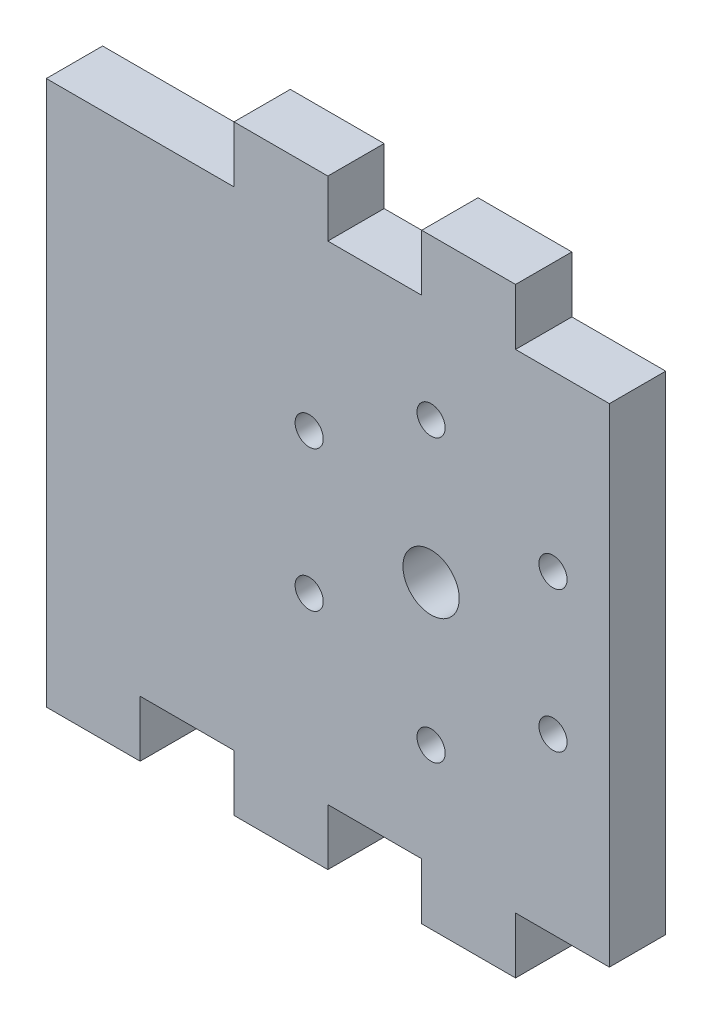
ISO-10303-21;
HEADER;
FILE_DESCRIPTION(('STEP AP214'),'2;1');
FILE_NAME('part.step','',(''),(''),'','','');
FILE_SCHEMA(('AUTOMOTIVE_DESIGN { 1 0 10303 214 1 1 1 1 }'));
ENDSEC;
DATA;
#1=APPLICATION_CONTEXT('core data for automotive mechanical design processes');
#2=APPLICATION_PROTOCOL_DEFINITION('international standard','automotive_design',2000,#1);
#3=PRODUCT_CONTEXT('',#1,'mechanical');
#4=PRODUCT('Part','Part','',(#3));
#5=PRODUCT_RELATED_PRODUCT_CATEGORY('part','',(#4));
#6=PRODUCT_DEFINITION_FORMATION('','',#4);
#7=PRODUCT_DEFINITION_CONTEXT('part definition',#1,'design');
#8=PRODUCT_DEFINITION('design','',#6,#7);
#9=PRODUCT_DEFINITION_SHAPE('','',#8);
#10=(LENGTH_UNIT() NAMED_UNIT(*) SI_UNIT(.MILLI.,.METRE.));
#11=(NAMED_UNIT(*) PLANE_ANGLE_UNIT() SI_UNIT($,.RADIAN.));
#12=(NAMED_UNIT(*) SI_UNIT($,.STERADIAN.) SOLID_ANGLE_UNIT());
#13=UNCERTAINTY_MEASURE_WITH_UNIT(LENGTH_MEASURE(1.E-05),#10,'distance_accuracy_value','');
#14=(GEOMETRIC_REPRESENTATION_CONTEXT(3) GLOBAL_UNCERTAINTY_ASSIGNED_CONTEXT((#13)) GLOBAL_UNIT_ASSIGNED_CONTEXT((#10,
#11,#12)) REPRESENTATION_CONTEXT('',''));
#15=CARTESIAN_POINT('',(0.,0.,0.));
#16=DIRECTION('',(0.,0.,1.));
#17=DIRECTION('',(1.,0.,0.));
#18=AXIS2_PLACEMENT_3D('',#15,#16,#17);
#19=CARTESIAN_POINT('',(0.,0.,3.));
#20=DIRECTION('',(0.,0.,-1.));
#21=DIRECTION('',(-1.,0.,0.));
#22=AXIS2_PLACEMENT_3D('',#19,#20,#21);
#23=PLANE('',#22);
#24=DIRECTION('',(1.,0.,0.));
#25=VECTOR('',#24,1.);
#26=CARTESIAN_POINT('',(25.,-26.,3.));
#27=LINE('',#26,#25);
#28=CARTESIAN_POINT('',(25.,-26.,3.));
#29=VERTEX_POINT('',#28);
#30=CARTESIAN_POINT('',(30.,-26.,3.));
#31=VERTEX_POINT('',#30);
#32=EDGE_CURVE('E256',#29,#31,#27,.T.);
#33=ORIENTED_EDGE('',*,*,#32,.T.);
#34=DIRECTION('',(0.,1.,0.));
#35=VECTOR('',#34,1.);
#36=CARTESIAN_POINT('',(30.,0.,3.));
#37=LINE('',#36,#35);
#38=CARTESIAN_POINT('',(30.,0.,3.));
#39=VERTEX_POINT('',#38);
#40=EDGE_CURVE('E134',#31,#39,#37,.T.);
#41=ORIENTED_EDGE('',*,*,#40,.T.);
#42=DIRECTION('',(-1.,0.,0.));
#43=VECTOR('',#42,1.);
#44=CARTESIAN_POINT('',(25.,0.,3.));
#45=LINE('',#44,#43);
#46=CARTESIAN_POINT('',(25.,0.,3.));
#47=VERTEX_POINT('',#46);
#48=EDGE_CURVE('E313',#39,#47,#45,.T.);
#49=ORIENTED_EDGE('',*,*,#48,.T.);
#50=DIRECTION('',(0.,1.,0.));
#51=VECTOR('',#50,1.);
#52=CARTESIAN_POINT('',(25.,2.99999999999994,3.));
#53=LINE('',#52,#51);
#54=CARTESIAN_POINT('',(25.,2.99999999999994,3.));
#55=VERTEX_POINT('',#54);
#56=EDGE_CURVE('E332',#47,#55,#53,.T.);
#57=ORIENTED_EDGE('',*,*,#56,.T.);
#58=DIRECTION('',(-1.,0.,0.));
#59=VECTOR('',#58,1.);
#60=CARTESIAN_POINT('',(20.,2.99999999999995,3.));
#61=LINE('',#60,#59);
#62=CARTESIAN_POINT('',(20.,2.99999999999995,3.));
#63=VERTEX_POINT('',#62);
#64=EDGE_CURVE('E329',#55,#63,#61,.T.);
#65=ORIENTED_EDGE('',*,*,#64,.T.);
#66=DIRECTION('',(0.,-1.,0.));
#67=VECTOR('',#66,1.);
#68=CARTESIAN_POINT('',(20.,0.,3.));
#69=LINE('',#68,#67);
#70=CARTESIAN_POINT('',(20.,0.,3.));
#71=VERTEX_POINT('',#70);
#72=EDGE_CURVE('E331',#63,#71,#69,.T.);
#73=ORIENTED_EDGE('',*,*,#72,.T.);
#74=DIRECTION('',(-1.,0.,0.));
#75=VECTOR('',#74,1.);
#76=CARTESIAN_POINT('',(14.9999999999999,0.,3.));
#77=LINE('',#76,#75);
#78=CARTESIAN_POINT('',(14.9999999999999,0.,3.));
#79=VERTEX_POINT('',#78);
#80=EDGE_CURVE('E334',#71,#79,#77,.T.);
#81=ORIENTED_EDGE('',*,*,#80,.T.);
#82=DIRECTION('',(0.,1.,0.));
#83=VECTOR('',#82,1.);
#84=CARTESIAN_POINT('',(14.9999999999999,2.99999999999994,3.));
#85=LINE('',#84,#83);
#86=CARTESIAN_POINT('',(14.9999999999999,2.99999999999994,3.));
#87=VERTEX_POINT('',#86);
#88=EDGE_CURVE('E340',#79,#87,#85,.T.);
#89=ORIENTED_EDGE('',*,*,#88,.T.);
#90=DIRECTION('',(-1.,0.,0.));
#91=VECTOR('',#90,1.);
#92=CARTESIAN_POINT('',(9.99999999999993,2.99999999999996,3.));
#93=LINE('',#92,#91);
#94=CARTESIAN_POINT('',(9.99999999999993,2.99999999999996,3.));
#95=VERTEX_POINT('',#94);
#96=EDGE_CURVE('E342',#87,#95,#93,.T.);
#97=ORIENTED_EDGE('',*,*,#96,.T.);
#98=DIRECTION('',(0.,-1.,0.));
#99=VECTOR('',#98,1.);
#100=CARTESIAN_POINT('',(9.99999999999994,0.,3.));
#101=LINE('',#100,#99);
#102=CARTESIAN_POINT('',(9.99999999999994,0.,3.));
#103=VERTEX_POINT('',#102);
#104=EDGE_CURVE('E344',#95,#103,#101,.T.);
#105=ORIENTED_EDGE('',*,*,#104,.T.);
#106=DIRECTION('',(-1.,0.,0.));
#107=VECTOR('',#106,1.);
#108=CARTESIAN_POINT('',(0.,0.,3.));
#109=LINE('',#108,#107);
#110=CARTESIAN_POINT('',(0.,0.,3.));
#111=VERTEX_POINT('',#110);
#112=EDGE_CURVE('E346',#103,#111,#109,.T.);
#113=ORIENTED_EDGE('',*,*,#112,.T.);
#114=DIRECTION('',(0.,-1.,0.));
#115=VECTOR('',#114,1.);
#116=CARTESIAN_POINT('',(0.,0.,3.));
#117=LINE('',#116,#115);
#118=CARTESIAN_POINT('',(0.,-29.,3.));
#119=VERTEX_POINT('',#118);
#120=EDGE_CURVE('E348',#111,#119,#117,.T.);
#121=ORIENTED_EDGE('',*,*,#120,.T.);
#122=DIRECTION('',(1.,0.,0.));
#123=VECTOR('',#122,1.);
#124=CARTESIAN_POINT('',(0.,-29.,3.));
#125=LINE('',#124,#123);
#126=CARTESIAN_POINT('',(4.99999999999994,-29.,3.));
#127=VERTEX_POINT('',#126);
#128=EDGE_CURVE('E350',#119,#127,#125,.T.);
#129=ORIENTED_EDGE('',*,*,#128,.T.);
#130=DIRECTION('',(0.,1.,0.));
#131=VECTOR('',#130,1.);
#132=CARTESIAN_POINT('',(4.99999999999994,-29.,3.));
#133=LINE('',#132,#131);
#134=CARTESIAN_POINT('',(4.99999999999994,-26.,3.));
#135=VERTEX_POINT('',#134);
#136=EDGE_CURVE('E352',#127,#135,#133,.T.);
#137=ORIENTED_EDGE('',*,*,#136,.T.);
#138=DIRECTION('',(1.,0.,0.));
#139=VECTOR('',#138,1.);
#140=CARTESIAN_POINT('',(4.99999999999994,-26.,3.));
#141=LINE('',#140,#139);
#142=CARTESIAN_POINT('',(9.99999999999994,-26.,3.));
#143=VERTEX_POINT('',#142);
#144=EDGE_CURVE('E354',#135,#143,#141,.T.);
#145=ORIENTED_EDGE('',*,*,#144,.T.);
#146=DIRECTION('',(0.,-1.,0.));
#147=VECTOR('',#146,1.);
#148=CARTESIAN_POINT('',(9.99999999999994,-26.,3.));
#149=LINE('',#148,#147);
#150=CARTESIAN_POINT('',(9.99999999999995,-29.,3.));
#151=VERTEX_POINT('',#150);
#152=EDGE_CURVE('E356',#143,#151,#149,.T.);
#153=ORIENTED_EDGE('',*,*,#152,.T.);
#154=DIRECTION('',(1.,0.,0.));
#155=VECTOR('',#154,1.);
#156=CARTESIAN_POINT('',(9.99999999999995,-29.,3.));
#157=LINE('',#156,#155);
#158=CARTESIAN_POINT('',(14.9999999999999,-29.,3.));
#159=VERTEX_POINT('',#158);
#160=EDGE_CURVE('E358',#151,#159,#157,.T.);
#161=ORIENTED_EDGE('',*,*,#160,.T.);
#162=DIRECTION('',(0.,1.,0.));
#163=VECTOR('',#162,1.);
#164=CARTESIAN_POINT('',(14.9999999999999,-29.,3.));
#165=LINE('',#164,#163);
#166=CARTESIAN_POINT('',(15.,-26.,3.));
#167=VERTEX_POINT('',#166);
#168=EDGE_CURVE('E360',#159,#167,#165,.T.);
#169=ORIENTED_EDGE('',*,*,#168,.T.);
#170=DIRECTION('',(1.,0.,0.));
#171=VECTOR('',#170,1.);
#172=CARTESIAN_POINT('',(15.,-26.,3.));
#173=LINE('',#172,#171);
#174=CARTESIAN_POINT('',(20.,-26.,3.));
#175=VERTEX_POINT('',#174);
#176=EDGE_CURVE('E195',#167,#175,#173,.T.);
#177=ORIENTED_EDGE('',*,*,#176,.T.);
#178=DIRECTION('',(0.,-1.,0.));
#179=VECTOR('',#178,1.);
#180=CARTESIAN_POINT('',(20.,-29.,3.));
#181=LINE('',#180,#179);
#182=CARTESIAN_POINT('',(20.,-29.,3.));
#183=VERTEX_POINT('',#182);
#184=EDGE_CURVE('E189',#175,#183,#181,.T.);
#185=ORIENTED_EDGE('',*,*,#184,.T.);
#186=DIRECTION('',(1.,0.,0.));
#187=VECTOR('',#186,1.);
#188=CARTESIAN_POINT('',(20.,-29.,3.));
#189=LINE('',#188,#187);
#190=CARTESIAN_POINT('',(25.,-29.,3.));
#191=VERTEX_POINT('',#190);
#192=EDGE_CURVE('E193',#183,#191,#189,.T.);
#193=ORIENTED_EDGE('',*,*,#192,.T.);
#194=DIRECTION('',(0.,1.,0.));
#195=VECTOR('',#194,1.);
#196=CARTESIAN_POINT('',(25.,-29.,3.));
#197=LINE('',#196,#195);
#198=EDGE_CURVE('E49',#191,#29,#197,.T.);
#199=ORIENTED_EDGE('',*,*,#198,.T.);
#200=EDGE_LOOP('',(#33,#41,#49,#57,#65,#73,#81,#89,#97,#105,#113,#121,#129,#137,#145,#153,#161,
#169,#177,#185,#193,#199));
#201=FACE_BOUND('',#200,.T.);
#202=CARTESIAN_POINT('',(20.5,-5.50000000000007,3.));
#203=DIRECTION('',(0.,0.,1.));
#204=DIRECTION('',(1.,0.,0.));
#205=AXIS2_PLACEMENT_3D('',#202,#203,#204);
#206=CIRCLE('',#205,0.750000000000002);
#207=CARTESIAN_POINT('',(21.25,-5.50000000000007,3.));
#208=VERTEX_POINT('',#207);
#209=EDGE_CURVE('E217',#208,#208,#206,.T.);
#210=ORIENTED_EDGE('',*,*,#209,.F.);
#211=EDGE_LOOP('',(#210));
#212=FACE_BOUND('',#211,.T.);
#213=CARTESIAN_POINT('',(20.5,-13.0000000000001,3.));
#214=DIRECTION('',(0.,0.,1.));
#215=DIRECTION('',(1.,0.,0.));
#216=AXIS2_PLACEMENT_3D('',#213,#214,#215);
#217=CIRCLE('',#216,1.5);
#218=CARTESIAN_POINT('',(22.,-13.0000000000001,3.));
#219=VERTEX_POINT('',#218);
#220=EDGE_CURVE('E454',#219,#219,#217,.T.);
#221=ORIENTED_EDGE('',*,*,#220,.F.);
#222=EDGE_LOOP('',(#221));
#223=FACE_BOUND('',#222,.T.);
#224=CARTESIAN_POINT('',(26.9951905283833,-9.25000000000007,3.));
#225=DIRECTION('',(0.,0.,1.));
#226=DIRECTION('',(1.,0.,0.));
#227=AXIS2_PLACEMENT_3D('',#224,#225,#226);
#228=CIRCLE('',#227,0.750000000000002);
#229=CARTESIAN_POINT('',(27.7451905283833,-9.25000000000007,3.));
#230=VERTEX_POINT('',#229);
#231=EDGE_CURVE('E448',#230,#230,#228,.T.);
#232=ORIENTED_EDGE('',*,*,#231,.F.);
#233=EDGE_LOOP('',(#232));
#234=FACE_BOUND('',#233,.T.);
#235=CARTESIAN_POINT('',(26.9951905283833,-16.7500000000001,3.));
#236=DIRECTION('',(0.,0.,1.));
#237=DIRECTION('',(1.,0.,0.));
#238=AXIS2_PLACEMENT_3D('',#235,#236,#237);
#239=CIRCLE('',#238,0.750000000000005);
#240=CARTESIAN_POINT('',(27.7451905283833,-16.7500000000001,3.));
#241=VERTEX_POINT('',#240);
#242=EDGE_CURVE('E442',#241,#241,#239,.T.);
#243=ORIENTED_EDGE('',*,*,#242,.F.);
#244=EDGE_LOOP('',(#243));
#245=FACE_BOUND('',#244,.T.);
#246=CARTESIAN_POINT('',(20.5,-20.5000000000001,3.));
#247=DIRECTION('',(0.,0.,1.));
#248=DIRECTION('',(1.,0.,0.));
#249=AXIS2_PLACEMENT_3D('',#246,#247,#248);
#250=CIRCLE('',#249,0.750000000000002);
#251=CARTESIAN_POINT('',(21.25,-20.5000000000001,3.));
#252=VERTEX_POINT('',#251);
#253=EDGE_CURVE('E436',#252,#252,#250,.T.);
#254=ORIENTED_EDGE('',*,*,#253,.F.);
#255=EDGE_LOOP('',(#254));
#256=FACE_BOUND('',#255,.T.);
#257=CARTESIAN_POINT('',(14.0048094716167,-16.7500000000001,3.));
#258=DIRECTION('',(0.,0.,1.));
#259=DIRECTION('',(1.,0.,0.));
#260=AXIS2_PLACEMENT_3D('',#257,#258,#259);
#261=CIRCLE('',#260,0.750000000000002);
#262=CARTESIAN_POINT('',(14.7548094716167,-16.7500000000001,3.));
#263=VERTEX_POINT('',#262);
#264=EDGE_CURVE('E430',#263,#263,#261,.T.);
#265=ORIENTED_EDGE('',*,*,#264,.F.);
#266=EDGE_LOOP('',(#265));
#267=FACE_BOUND('',#266,.T.);
#268=CARTESIAN_POINT('',(14.0048094716167,-9.25000000000008,3.));
#269=DIRECTION('',(0.,0.,1.));
#270=DIRECTION('',(1.,0.,0.));
#271=AXIS2_PLACEMENT_3D('',#268,#269,#270);
#272=CIRCLE('',#271,0.750000000000002);
#273=CARTESIAN_POINT('',(14.7548094716167,-9.25000000000008,3.));
#274=VERTEX_POINT('',#273);
#275=EDGE_CURVE('E421',#274,#274,#272,.T.);
#276=ORIENTED_EDGE('',*,*,#275,.F.);
#277=EDGE_LOOP('',(#276));
#278=FACE_BOUND('',#277,.T.);
#279=ADVANCED_FACE('F32',(#201,#212,#223,#234,#245,#256,#267,#278),#23,.F.);
#280=CARTESIAN_POINT('',(0.,0.,0.));
#281=DIRECTION('',(0.,0.,-1.));
#282=DIRECTION('',(-1.,0.,0.));
#283=AXIS2_PLACEMENT_3D('',#280,#281,#282);
#284=PLANE('',#283);
#285=CARTESIAN_POINT('',(14.0048094716167,-16.7500000000001,0.));
#286=DIRECTION('',(0.,0.,1.));
#287=DIRECTION('',(1.,0.,0.));
#288=AXIS2_PLACEMENT_3D('',#285,#286,#287);
#289=CIRCLE('',#288,0.750000000000002);
#290=CARTESIAN_POINT('',(14.7548094716167,-16.7500000000001,0.));
#291=VERTEX_POINT('',#290);
#292=EDGE_CURVE('E427',#291,#291,#289,.T.);
#293=ORIENTED_EDGE('',*,*,#292,.T.);
#294=EDGE_LOOP('',(#293));
#295=FACE_BOUND('',#294,.T.);
#296=CARTESIAN_POINT('',(26.9951905283833,-16.7500000000001,0.));
#297=DIRECTION('',(0.,0.,1.));
#298=DIRECTION('',(1.,0.,0.));
#299=AXIS2_PLACEMENT_3D('',#296,#297,#298);
#300=CIRCLE('',#299,0.750000000000005);
#301=CARTESIAN_POINT('',(27.7451905283833,-16.7500000000001,0.));
#302=VERTEX_POINT('',#301);
#303=EDGE_CURVE('E439',#302,#302,#300,.T.);
#304=ORIENTED_EDGE('',*,*,#303,.T.);
#305=EDGE_LOOP('',(#304));
#306=FACE_BOUND('',#305,.T.);
#307=CARTESIAN_POINT('',(20.5,-13.0000000000001,0.));
#308=DIRECTION('',(0.,0.,1.));
#309=DIRECTION('',(1.,0.,0.));
#310=AXIS2_PLACEMENT_3D('',#307,#308,#309);
#311=CIRCLE('',#310,1.5);
#312=CARTESIAN_POINT('',(22.,-13.0000000000001,0.));
#313=VERTEX_POINT('',#312);
#314=EDGE_CURVE('E451',#313,#313,#311,.T.);
#315=ORIENTED_EDGE('',*,*,#314,.T.);
#316=EDGE_LOOP('',(#315));
#317=FACE_BOUND('',#316,.T.);
#318=DIRECTION('',(1.,0.,0.));
#319=VECTOR('',#318,1.);
#320=CARTESIAN_POINT('',(25.,-26.,0.));
#321=LINE('',#320,#319);
#322=CARTESIAN_POINT('',(25.,-26.,0.));
#323=VERTEX_POINT('',#322);
#324=CARTESIAN_POINT('',(30.,-26.,0.));
#325=VERTEX_POINT('',#324);
#326=EDGE_CURVE('E213',#323,#325,#321,.T.);
#327=ORIENTED_EDGE('',*,*,#326,.F.);
#328=DIRECTION('',(0.,1.,0.));
#329=VECTOR('',#328,1.);
#330=CARTESIAN_POINT('',(25.,-29.,0.));
#331=LINE('',#330,#329);
#332=CARTESIAN_POINT('',(25.,-29.,0.));
#333=VERTEX_POINT('',#332);
#334=EDGE_CURVE('E126',#333,#323,#331,.T.);
#335=ORIENTED_EDGE('',*,*,#334,.F.);
#336=DIRECTION('',(1.,0.,0.));
#337=VECTOR('',#336,1.);
#338=CARTESIAN_POINT('',(20.,-29.,0.));
#339=LINE('',#338,#337);
#340=CARTESIAN_POINT('',(20.,-29.,0.));
#341=VERTEX_POINT('',#340);
#342=EDGE_CURVE('E120',#341,#333,#339,.T.);
#343=ORIENTED_EDGE('',*,*,#342,.F.);
#344=DIRECTION('',(0.,-1.,0.));
#345=VECTOR('',#344,1.);
#346=CARTESIAN_POINT('',(20.,-29.,0.));
#347=LINE('',#346,#345);
#348=CARTESIAN_POINT('',(20.,-26.,0.));
#349=VERTEX_POINT('',#348);
#350=EDGE_CURVE('E203',#349,#341,#347,.T.);
#351=ORIENTED_EDGE('',*,*,#350,.F.);
#352=DIRECTION('',(1.,0.,0.));
#353=VECTOR('',#352,1.);
#354=CARTESIAN_POINT('',(15.,-26.,0.));
#355=LINE('',#354,#353);
#356=CARTESIAN_POINT('',(15.,-26.,0.));
#357=VERTEX_POINT('',#356);
#358=EDGE_CURVE('E251',#357,#349,#355,.T.);
#359=ORIENTED_EDGE('',*,*,#358,.F.);
#360=DIRECTION('',(0.,1.,0.));
#361=VECTOR('',#360,1.);
#362=CARTESIAN_POINT('',(14.9999999999999,-29.,0.));
#363=LINE('',#362,#361);
#364=CARTESIAN_POINT('',(14.9999999999999,-29.,0.));
#365=VERTEX_POINT('',#364);
#366=EDGE_CURVE('E249',#365,#357,#363,.T.);
#367=ORIENTED_EDGE('',*,*,#366,.F.);
#368=DIRECTION('',(1.,0.,0.));
#369=VECTOR('',#368,1.);
#370=CARTESIAN_POINT('',(9.99999999999995,-29.,0.));
#371=LINE('',#370,#369);
#372=CARTESIAN_POINT('',(9.99999999999995,-29.,0.));
#373=VERTEX_POINT('',#372);
#374=EDGE_CURVE('E247',#373,#365,#371,.T.);
#375=ORIENTED_EDGE('',*,*,#374,.F.);
#376=DIRECTION('',(0.,-1.,0.));
#377=VECTOR('',#376,1.);
#378=CARTESIAN_POINT('',(9.99999999999994,-26.,0.));
#379=LINE('',#378,#377);
#380=CARTESIAN_POINT('',(9.99999999999994,-26.,0.));
#381=VERTEX_POINT('',#380);
#382=EDGE_CURVE('E245',#381,#373,#379,.T.);
#383=ORIENTED_EDGE('',*,*,#382,.F.);
#384=DIRECTION('',(1.,0.,0.));
#385=VECTOR('',#384,1.);
#386=CARTESIAN_POINT('',(4.99999999999994,-26.,0.));
#387=LINE('',#386,#385);
#388=CARTESIAN_POINT('',(4.99999999999994,-26.,0.));
#389=VERTEX_POINT('',#388);
#390=EDGE_CURVE('E243',#389,#381,#387,.T.);
#391=ORIENTED_EDGE('',*,*,#390,.F.);
#392=DIRECTION('',(0.,1.,0.));
#393=VECTOR('',#392,1.);
#394=CARTESIAN_POINT('',(4.99999999999994,-29.,0.));
#395=LINE('',#394,#393);
#396=CARTESIAN_POINT('',(4.99999999999994,-29.,0.));
#397=VERTEX_POINT('',#396);
#398=EDGE_CURVE('E241',#397,#389,#395,.T.);
#399=ORIENTED_EDGE('',*,*,#398,.F.);
#400=DIRECTION('',(1.,0.,0.));
#401=VECTOR('',#400,1.);
#402=CARTESIAN_POINT('',(0.,-29.,0.));
#403=LINE('',#402,#401);
#404=CARTESIAN_POINT('',(0.,-29.,0.));
#405=VERTEX_POINT('',#404);
#406=EDGE_CURVE('E239',#405,#397,#403,.T.);
#407=ORIENTED_EDGE('',*,*,#406,.F.);
#408=DIRECTION('',(0.,-1.,0.));
#409=VECTOR('',#408,1.);
#410=CARTESIAN_POINT('',(0.,0.,0.));
#411=LINE('',#410,#409);
#412=CARTESIAN_POINT('',(0.,0.,0.));
#413=VERTEX_POINT('',#412);
#414=EDGE_CURVE('E237',#413,#405,#411,.T.);
#415=ORIENTED_EDGE('',*,*,#414,.F.);
#416=DIRECTION('',(-1.,0.,0.));
#417=VECTOR('',#416,1.);
#418=CARTESIAN_POINT('',(0.,0.,0.));
#419=LINE('',#418,#417);
#420=CARTESIAN_POINT('',(9.99999999999994,0.,0.));
#421=VERTEX_POINT('',#420);
#422=EDGE_CURVE('E235',#421,#413,#419,.T.);
#423=ORIENTED_EDGE('',*,*,#422,.F.);
#424=DIRECTION('',(0.,-1.,0.));
#425=VECTOR('',#424,1.);
#426=CARTESIAN_POINT('',(9.99999999999994,0.,0.));
#427=LINE('',#426,#425);
#428=CARTESIAN_POINT('',(9.99999999999993,2.99999999999996,0.));
#429=VERTEX_POINT('',#428);
#430=EDGE_CURVE('E233',#429,#421,#427,.T.);
#431=ORIENTED_EDGE('',*,*,#430,.F.);
#432=DIRECTION('',(-1.,0.,0.));
#433=VECTOR('',#432,1.);
#434=CARTESIAN_POINT('',(9.99999999999993,2.99999999999996,0.));
#435=LINE('',#434,#433);
#436=CARTESIAN_POINT('',(14.9999999999999,2.99999999999994,0.));
#437=VERTEX_POINT('',#436);
#438=EDGE_CURVE('E231',#437,#429,#435,.T.);
#439=ORIENTED_EDGE('',*,*,#438,.F.);
#440=DIRECTION('',(0.,1.,0.));
#441=VECTOR('',#440,1.);
#442=CARTESIAN_POINT('',(14.9999999999999,2.99999999999994,0.));
#443=LINE('',#442,#441);
#444=CARTESIAN_POINT('',(14.9999999999999,0.,0.));
#445=VERTEX_POINT('',#444);
#446=EDGE_CURVE('E229',#445,#437,#443,.T.);
#447=ORIENTED_EDGE('',*,*,#446,.F.);
#448=DIRECTION('',(-1.,0.,0.));
#449=VECTOR('',#448,1.);
#450=CARTESIAN_POINT('',(14.9999999999999,0.,0.));
#451=LINE('',#450,#449);
#452=CARTESIAN_POINT('',(20.,0.,0.));
#453=VERTEX_POINT('',#452);
#454=EDGE_CURVE('E227',#453,#445,#451,.T.);
#455=ORIENTED_EDGE('',*,*,#454,.F.);
#456=DIRECTION('',(0.,-1.,0.));
#457=VECTOR('',#456,1.);
#458=CARTESIAN_POINT('',(20.,0.,0.));
#459=LINE('',#458,#457);
#460=CARTESIAN_POINT('',(20.,2.99999999999995,0.));
#461=VERTEX_POINT('',#460);
#462=EDGE_CURVE('E225',#461,#453,#459,.T.);
#463=ORIENTED_EDGE('',*,*,#462,.F.);
#464=DIRECTION('',(-1.,0.,0.));
#465=VECTOR('',#464,1.);
#466=CARTESIAN_POINT('',(20.,2.99999999999995,0.));
#467=LINE('',#466,#465);
#468=CARTESIAN_POINT('',(25.,2.99999999999994,0.));
#469=VERTEX_POINT('',#468);
#470=EDGE_CURVE('E223',#469,#461,#467,.T.);
#471=ORIENTED_EDGE('',*,*,#470,.F.);
#472=DIRECTION('',(0.,1.,0.));
#473=VECTOR('',#472,1.);
#474=CARTESIAN_POINT('',(25.,2.99999999999994,0.));
#475=LINE('',#474,#473);
#476=CARTESIAN_POINT('',(25.,0.,0.));
#477=VERTEX_POINT('',#476);
#478=EDGE_CURVE('E221',#477,#469,#475,.T.);
#479=ORIENTED_EDGE('',*,*,#478,.F.);
#480=DIRECTION('',(-1.,0.,0.));
#481=VECTOR('',#480,1.);
#482=CARTESIAN_POINT('',(25.,0.,0.));
#483=LINE('',#482,#481);
#484=CARTESIAN_POINT('',(30.,0.,0.));
#485=VERTEX_POINT('',#484);
#486=EDGE_CURVE('E219',#485,#477,#483,.T.);
#487=ORIENTED_EDGE('',*,*,#486,.F.);
#488=DIRECTION('',(0.,1.,0.));
#489=VECTOR('',#488,1.);
#490=CARTESIAN_POINT('',(30.,0.,0.));
#491=LINE('',#490,#489);
#492=EDGE_CURVE('E216',#325,#485,#491,.T.);
#493=ORIENTED_EDGE('',*,*,#492,.F.);
#494=EDGE_LOOP('',(#327,#335,#343,#351,#359,#367,#375,#383,#391,#399,#407,#415,#423,#431,#439,
#447,#455,#463,#471,#479,#487,#493));
#495=FACE_BOUND('',#494,.T.);
#496=CARTESIAN_POINT('',(20.5,-5.50000000000007,0.));
#497=DIRECTION('',(0.,0.,1.));
#498=DIRECTION('',(1.,0.,0.));
#499=AXIS2_PLACEMENT_3D('',#496,#497,#498);
#500=CIRCLE('',#499,0.750000000000002);
#501=CARTESIAN_POINT('',(21.25,-5.50000000000007,0.));
#502=VERTEX_POINT('',#501);
#503=EDGE_CURVE('E457',#502,#502,#500,.T.);
#504=ORIENTED_EDGE('',*,*,#503,.T.);
#505=EDGE_LOOP('',(#504));
#506=FACE_BOUND('',#505,.T.);
#507=CARTESIAN_POINT('',(26.9951905283833,-9.25000000000007,0.));
#508=DIRECTION('',(0.,0.,1.));
#509=DIRECTION('',(1.,0.,0.));
#510=AXIS2_PLACEMENT_3D('',#507,#508,#509);
#511=CIRCLE('',#510,0.750000000000002);
#512=CARTESIAN_POINT('',(27.7451905283833,-9.25000000000007,0.));
#513=VERTEX_POINT('',#512);
#514=EDGE_CURVE('E445',#513,#513,#511,.T.);
#515=ORIENTED_EDGE('',*,*,#514,.T.);
#516=EDGE_LOOP('',(#515));
#517=FACE_BOUND('',#516,.T.);
#518=CARTESIAN_POINT('',(20.5,-20.5000000000001,0.));
#519=DIRECTION('',(0.,0.,1.));
#520=DIRECTION('',(1.,0.,0.));
#521=AXIS2_PLACEMENT_3D('',#518,#519,#520);
#522=CIRCLE('',#521,0.750000000000002);
#523=CARTESIAN_POINT('',(21.25,-20.5000000000001,0.));
#524=VERTEX_POINT('',#523);
#525=EDGE_CURVE('E433',#524,#524,#522,.T.);
#526=ORIENTED_EDGE('',*,*,#525,.T.);
#527=EDGE_LOOP('',(#526));
#528=FACE_BOUND('',#527,.T.);
#529=CARTESIAN_POINT('',(14.0048094716167,-9.25000000000008,0.));
#530=DIRECTION('',(0.,0.,1.));
#531=DIRECTION('',(1.,0.,0.));
#532=AXIS2_PLACEMENT_3D('',#529,#530,#531);
#533=CIRCLE('',#532,0.750000000000002);
#534=CARTESIAN_POINT('',(14.7548094716167,-9.25000000000008,0.));
#535=VERTEX_POINT('',#534);
#536=EDGE_CURVE('E424',#535,#535,#533,.T.);
#537=ORIENTED_EDGE('',*,*,#536,.T.);
#538=EDGE_LOOP('',(#537));
#539=FACE_BOUND('',#538,.T.);
#540=ADVANCED_FACE('F317',(#295,#306,#317,#495,#506,#517,#528,#539),#284,.T.);
#541=CARTESIAN_POINT('',(25.,-26.,3.));
#542=DIRECTION('',(0.,1.,0.));
#543=DIRECTION('',(-1.,0.,0.));
#544=AXIS2_PLACEMENT_3D('',#541,#542,#543);
#545=PLANE('',#544);
#546=ORIENTED_EDGE('',*,*,#326,.T.);
#547=DIRECTION('',(0.,0.,-1.));
#548=VECTOR('',#547,1.);
#549=CARTESIAN_POINT('',(30.,-26.,3.));
#550=LINE('',#549,#548);
#551=EDGE_CURVE('E11',#31,#325,#550,.T.);
#552=ORIENTED_EDGE('',*,*,#551,.F.);
#553=ORIENTED_EDGE('',*,*,#32,.F.);
#554=DIRECTION('',(0.,0.,-1.));
#555=VECTOR('',#554,1.);
#556=CARTESIAN_POINT('',(25.,-26.,3.));
#557=LINE('',#556,#555);
#558=EDGE_CURVE('E209',#29,#323,#557,.T.);
#559=ORIENTED_EDGE('',*,*,#558,.T.);
#560=EDGE_LOOP('',(#546,#552,#553,#559));
#561=FACE_BOUND('',#560,.T.);
#562=ADVANCED_FACE('F34',(#561),#545,.F.);
#563=CARTESIAN_POINT('',(30.,0.,3.));
#564=DIRECTION('',(-1.,0.,0.));
#565=DIRECTION('',(0.,-1.,0.));
#566=AXIS2_PLACEMENT_3D('',#563,#564,#565);
#567=PLANE('',#566);
#568=ORIENTED_EDGE('',*,*,#492,.T.);
#569=DIRECTION('',(0.,0.,-1.));
#570=VECTOR('',#569,1.);
#571=CARTESIAN_POINT('',(30.,0.,3.));
#572=LINE('',#571,#570);
#573=EDGE_CURVE('E41',#39,#485,#572,.T.);
#574=ORIENTED_EDGE('',*,*,#573,.F.);
#575=ORIENTED_EDGE('',*,*,#40,.F.);
#576=ORIENTED_EDGE('',*,*,#551,.T.);
#577=EDGE_LOOP('',(#568,#574,#575,#576));
#578=FACE_BOUND('',#577,.T.);
#579=ADVANCED_FACE('F696',(#578),#567,.F.);
#580=CARTESIAN_POINT('',(25.,0.,3.));
#581=DIRECTION('',(0.,-1.,0.));
#582=DIRECTION('',(1.,0.,0.));
#583=AXIS2_PLACEMENT_3D('',#580,#581,#582);
#584=PLANE('',#583);
#585=ORIENTED_EDGE('',*,*,#486,.T.);
#586=DIRECTION('',(0.,0.,-1.));
#587=VECTOR('',#586,1.);
#588=CARTESIAN_POINT('',(25.,0.,3.));
#589=LINE('',#588,#587);
#590=EDGE_CURVE('E305',#47,#477,#589,.T.);
#591=ORIENTED_EDGE('',*,*,#590,.F.);
#592=ORIENTED_EDGE('',*,*,#48,.F.);
#593=ORIENTED_EDGE('',*,*,#573,.T.);
#594=EDGE_LOOP('',(#585,#591,#592,#593));
#595=FACE_BOUND('',#594,.T.);
#596=ADVANCED_FACE('F311',(#595),#584,.F.);
#597=CARTESIAN_POINT('',(25.,2.99999999999994,3.));
#598=DIRECTION('',(-1.,0.,0.));
#599=DIRECTION('',(0.,-1.,0.));
#600=AXIS2_PLACEMENT_3D('',#597,#598,#599);
#601=PLANE('',#600);
#602=ORIENTED_EDGE('',*,*,#478,.T.);
#603=DIRECTION('',(0.,0.,-1.));
#604=VECTOR('',#603,1.);
#605=CARTESIAN_POINT('',(25.,2.99999999999994,3.));
#606=LINE('',#605,#604);
#607=EDGE_CURVE('E302',#55,#469,#606,.T.);
#608=ORIENTED_EDGE('',*,*,#607,.F.);
#609=ORIENTED_EDGE('',*,*,#56,.F.);
#610=ORIENTED_EDGE('',*,*,#590,.T.);
#611=EDGE_LOOP('',(#602,#608,#609,#610));
#612=FACE_BOUND('',#611,.T.);
#613=ADVANCED_FACE('F323',(#612),#601,.F.);
#614=CARTESIAN_POINT('',(20.,2.99999999999995,3.));
#615=DIRECTION('',(0.,-1.,0.));
#616=DIRECTION('',(1.,0.,0.));
#617=AXIS2_PLACEMENT_3D('',#614,#615,#616);
#618=PLANE('',#617);
#619=ORIENTED_EDGE('',*,*,#470,.T.);
#620=DIRECTION('',(0.,0.,-1.));
#621=VECTOR('',#620,1.);
#622=CARTESIAN_POINT('',(20.,2.99999999999995,3.));
#623=LINE('',#622,#621);
#624=EDGE_CURVE('E299',#63,#461,#623,.T.);
#625=ORIENTED_EDGE('',*,*,#624,.F.);
#626=ORIENTED_EDGE('',*,*,#64,.F.);
#627=ORIENTED_EDGE('',*,*,#607,.T.);
#628=EDGE_LOOP('',(#619,#625,#626,#627));
#629=FACE_BOUND('',#628,.T.);
#630=ADVANCED_FACE('F327',(#629),#618,.F.);
#631=CARTESIAN_POINT('',(20.,0.,3.));
#632=DIRECTION('',(1.,0.,0.));
#633=DIRECTION('',(0.,0.,-1.));
#634=AXIS2_PLACEMENT_3D('',#631,#632,#633);
#635=PLANE('',#634);
#636=ORIENTED_EDGE('',*,*,#462,.T.);
#637=DIRECTION('',(0.,0.,-1.));
#638=VECTOR('',#637,1.);
#639=CARTESIAN_POINT('',(20.,0.,3.));
#640=LINE('',#639,#638);
#641=EDGE_CURVE('E296',#71,#453,#640,.T.);
#642=ORIENTED_EDGE('',*,*,#641,.F.);
#643=ORIENTED_EDGE('',*,*,#72,.F.);
#644=ORIENTED_EDGE('',*,*,#624,.T.);
#645=EDGE_LOOP('',(#636,#642,#643,#644));
#646=FACE_BOUND('',#645,.T.);
#647=ADVANCED_FACE('F661',(#646),#635,.F.);
#648=CARTESIAN_POINT('',(14.9999999999999,0.,3.));
#649=DIRECTION('',(0.,-1.,0.));
#650=DIRECTION('',(1.,0.,0.));
#651=AXIS2_PLACEMENT_3D('',#648,#649,#650);
#652=PLANE('',#651);
#653=ORIENTED_EDGE('',*,*,#454,.T.);
#654=DIRECTION('',(0.,0.,-1.));
#655=VECTOR('',#654,1.);
#656=CARTESIAN_POINT('',(14.9999999999999,0.,3.));
#657=LINE('',#656,#655);
#658=EDGE_CURVE('E293',#79,#445,#657,.T.);
#659=ORIENTED_EDGE('',*,*,#658,.F.);
#660=ORIENTED_EDGE('',*,*,#80,.F.);
#661=ORIENTED_EDGE('',*,*,#641,.T.);
#662=EDGE_LOOP('',(#653,#659,#660,#661));
#663=FACE_BOUND('',#662,.T.);
#664=ADVANCED_FACE('F651',(#663),#652,.F.);
#665=CARTESIAN_POINT('',(14.9999999999999,2.99999999999994,3.));
#666=DIRECTION('',(-1.,0.,0.));
#667=DIRECTION('',(0.,-1.,0.));
#668=AXIS2_PLACEMENT_3D('',#665,#666,#667);
#669=PLANE('',#668);
#670=ORIENTED_EDGE('',*,*,#446,.T.);
#671=DIRECTION('',(0.,0.,-1.));
#672=VECTOR('',#671,1.);
#673=CARTESIAN_POINT('',(14.9999999999999,2.99999999999994,3.));
#674=LINE('',#673,#672);
#675=EDGE_CURVE('E290',#87,#437,#674,.T.);
#676=ORIENTED_EDGE('',*,*,#675,.F.);
#677=ORIENTED_EDGE('',*,*,#88,.F.);
#678=ORIENTED_EDGE('',*,*,#658,.T.);
#679=EDGE_LOOP('',(#670,#676,#677,#678));
#680=FACE_BOUND('',#679,.T.);
#681=ADVANCED_FACE('F641',(#680),#669,.F.);
#682=CARTESIAN_POINT('',(9.99999999999993,2.99999999999996,3.));
#683=DIRECTION('',(0.,-1.,0.));
#684=DIRECTION('',(1.,0.,0.));
#685=AXIS2_PLACEMENT_3D('',#682,#683,#684);
#686=PLANE('',#685);
#687=ORIENTED_EDGE('',*,*,#438,.T.);
#688=DIRECTION('',(0.,0.,-1.));
#689=VECTOR('',#688,1.);
#690=CARTESIAN_POINT('',(9.99999999999993,2.99999999999996,3.));
#691=LINE('',#690,#689);
#692=EDGE_CURVE('E287',#95,#429,#691,.T.);
#693=ORIENTED_EDGE('',*,*,#692,.F.);
#694=ORIENTED_EDGE('',*,*,#96,.F.);
#695=ORIENTED_EDGE('',*,*,#675,.T.);
#696=EDGE_LOOP('',(#687,#693,#694,#695));
#697=FACE_BOUND('',#696,.T.);
#698=ADVANCED_FACE('F631',(#697),#686,.F.);
#699=CARTESIAN_POINT('',(9.99999999999994,0.,3.));
#700=DIRECTION('',(1.,0.,0.));
#701=DIRECTION('',(0.,1.,0.));
#702=AXIS2_PLACEMENT_3D('',#699,#700,#701);
#703=PLANE('',#702);
#704=ORIENTED_EDGE('',*,*,#430,.T.);
#705=DIRECTION('',(0.,0.,-1.));
#706=VECTOR('',#705,1.);
#707=CARTESIAN_POINT('',(9.99999999999994,0.,3.));
#708=LINE('',#707,#706);
#709=EDGE_CURVE('E284',#103,#421,#708,.T.);
#710=ORIENTED_EDGE('',*,*,#709,.F.);
#711=ORIENTED_EDGE('',*,*,#104,.F.);
#712=ORIENTED_EDGE('',*,*,#692,.T.);
#713=EDGE_LOOP('',(#704,#710,#711,#712));
#714=FACE_BOUND('',#713,.T.);
#715=ADVANCED_FACE('F621',(#714),#703,.F.);
#716=CARTESIAN_POINT('',(0.,0.,3.));
#717=DIRECTION('',(0.,-1.,0.));
#718=DIRECTION('',(1.,0.,0.));
#719=AXIS2_PLACEMENT_3D('',#716,#717,#718);
#720=PLANE('',#719);
#721=ORIENTED_EDGE('',*,*,#422,.T.);
#722=DIRECTION('',(0.,0.,-1.));
#723=VECTOR('',#722,1.);
#724=CARTESIAN_POINT('',(0.,0.,3.));
#725=LINE('',#724,#723);
#726=EDGE_CURVE('E281',#111,#413,#725,.T.);
#727=ORIENTED_EDGE('',*,*,#726,.F.);
#728=ORIENTED_EDGE('',*,*,#112,.F.);
#729=ORIENTED_EDGE('',*,*,#709,.T.);
#730=EDGE_LOOP('',(#721,#727,#728,#729));
#731=FACE_BOUND('',#730,.T.);
#732=ADVANCED_FACE('F611',(#731),#720,.F.);
#733=CARTESIAN_POINT('',(0.,0.,3.));
#734=DIRECTION('',(1.,0.,0.));
#735=DIRECTION('',(0.,1.,0.));
#736=AXIS2_PLACEMENT_3D('',#733,#734,#735);
#737=PLANE('',#736);
#738=ORIENTED_EDGE('',*,*,#414,.T.);
#739=DIRECTION('',(0.,0.,-1.));
#740=VECTOR('',#739,1.);
#741=CARTESIAN_POINT('',(0.,-29.,3.));
#742=LINE('',#741,#740);
#743=EDGE_CURVE('E278',#119,#405,#742,.T.);
#744=ORIENTED_EDGE('',*,*,#743,.F.);
#745=ORIENTED_EDGE('',*,*,#120,.F.);
#746=ORIENTED_EDGE('',*,*,#726,.T.);
#747=EDGE_LOOP('',(#738,#744,#745,#746));
#748=FACE_BOUND('',#747,.T.);
#749=ADVANCED_FACE('F601',(#748),#737,.F.);
#750=CARTESIAN_POINT('',(0.,-29.,3.));
#751=DIRECTION('',(0.,1.,0.));
#752=DIRECTION('',(0.,0.,1.));
#753=AXIS2_PLACEMENT_3D('',#750,#751,#752);
#754=PLANE('',#753);
#755=ORIENTED_EDGE('',*,*,#406,.T.);
#756=DIRECTION('',(0.,0.,-1.));
#757=VECTOR('',#756,1.);
#758=CARTESIAN_POINT('',(4.99999999999994,-29.,3.));
#759=LINE('',#758,#757);
#760=EDGE_CURVE('E275',#127,#397,#759,.T.);
#761=ORIENTED_EDGE('',*,*,#760,.F.);
#762=ORIENTED_EDGE('',*,*,#128,.F.);
#763=ORIENTED_EDGE('',*,*,#743,.T.);
#764=EDGE_LOOP('',(#755,#761,#762,#763));
#765=FACE_BOUND('',#764,.T.);
#766=ADVANCED_FACE('F591',(#765),#754,.F.);
#767=CARTESIAN_POINT('',(4.99999999999994,-29.,3.));
#768=DIRECTION('',(-1.,0.,0.));
#769=DIRECTION('',(0.,0.,1.));
#770=AXIS2_PLACEMENT_3D('',#767,#768,#769);
#771=PLANE('',#770);
#772=ORIENTED_EDGE('',*,*,#398,.T.);
#773=DIRECTION('',(0.,0.,-1.));
#774=VECTOR('',#773,1.);
#775=CARTESIAN_POINT('',(4.99999999999994,-26.,3.));
#776=LINE('',#775,#774);
#777=EDGE_CURVE('E272',#135,#389,#776,.T.);
#778=ORIENTED_EDGE('',*,*,#777,.F.);
#779=ORIENTED_EDGE('',*,*,#136,.F.);
#780=ORIENTED_EDGE('',*,*,#760,.T.);
#781=EDGE_LOOP('',(#772,#778,#779,#780));
#782=FACE_BOUND('',#781,.T.);
#783=ADVANCED_FACE('F581',(#782),#771,.F.);
#784=CARTESIAN_POINT('',(4.99999999999994,-26.,3.));
#785=DIRECTION('',(0.,1.,0.));
#786=DIRECTION('',(-1.,0.,0.));
#787=AXIS2_PLACEMENT_3D('',#784,#785,#786);
#788=PLANE('',#787);
#789=ORIENTED_EDGE('',*,*,#390,.T.);
#790=DIRECTION('',(0.,0.,-1.));
#791=VECTOR('',#790,1.);
#792=CARTESIAN_POINT('',(9.99999999999994,-26.,3.));
#793=LINE('',#792,#791);
#794=EDGE_CURVE('E269',#143,#381,#793,.T.);
#795=ORIENTED_EDGE('',*,*,#794,.F.);
#796=ORIENTED_EDGE('',*,*,#144,.F.);
#797=ORIENTED_EDGE('',*,*,#777,.T.);
#798=EDGE_LOOP('',(#789,#795,#796,#797));
#799=FACE_BOUND('',#798,.T.);
#800=ADVANCED_FACE('F571',(#799),#788,.F.);
#801=CARTESIAN_POINT('',(9.99999999999994,-26.,3.));
#802=DIRECTION('',(1.,0.,0.));
#803=DIRECTION('',(0.,1.,0.));
#804=AXIS2_PLACEMENT_3D('',#801,#802,#803);
#805=PLANE('',#804);
#806=ORIENTED_EDGE('',*,*,#382,.T.);
#807=DIRECTION('',(0.,0.,-1.));
#808=VECTOR('',#807,1.);
#809=CARTESIAN_POINT('',(9.99999999999995,-29.,3.));
#810=LINE('',#809,#808);
#811=EDGE_CURVE('E266',#151,#373,#810,.T.);
#812=ORIENTED_EDGE('',*,*,#811,.F.);
#813=ORIENTED_EDGE('',*,*,#152,.F.);
#814=ORIENTED_EDGE('',*,*,#794,.T.);
#815=EDGE_LOOP('',(#806,#812,#813,#814));
#816=FACE_BOUND('',#815,.T.);
#817=ADVANCED_FACE('F561',(#816),#805,.F.);
#818=CARTESIAN_POINT('',(9.99999999999995,-29.,3.));
#819=DIRECTION('',(0.,1.,0.));
#820=DIRECTION('',(0.,0.,1.));
#821=AXIS2_PLACEMENT_3D('',#818,#819,#820);
#822=PLANE('',#821);
#823=ORIENTED_EDGE('',*,*,#374,.T.);
#824=DIRECTION('',(0.,0.,-1.));
#825=VECTOR('',#824,1.);
#826=CARTESIAN_POINT('',(14.9999999999999,-29.,3.));
#827=LINE('',#826,#825);
#828=EDGE_CURVE('E263',#159,#365,#827,.T.);
#829=ORIENTED_EDGE('',*,*,#828,.F.);
#830=ORIENTED_EDGE('',*,*,#160,.F.);
#831=ORIENTED_EDGE('',*,*,#811,.T.);
#832=EDGE_LOOP('',(#823,#829,#830,#831));
#833=FACE_BOUND('',#832,.T.);
#834=ADVANCED_FACE('F552',(#833),#822,.F.);
#835=CARTESIAN_POINT('',(14.9999999999999,-29.,3.));
#836=DIRECTION('',(-1.,0.,0.));
#837=DIRECTION('',(0.,-1.,0.));
#838=AXIS2_PLACEMENT_3D('',#835,#836,#837);
#839=PLANE('',#838);
#840=ORIENTED_EDGE('',*,*,#366,.T.);
#841=DIRECTION('',(0.,0.,-1.));
#842=VECTOR('',#841,1.);
#843=CARTESIAN_POINT('',(15.,-26.,3.));
#844=LINE('',#843,#842);
#845=EDGE_CURVE('E260',#167,#357,#844,.T.);
#846=ORIENTED_EDGE('',*,*,#845,.F.);
#847=ORIENTED_EDGE('',*,*,#168,.F.);
#848=ORIENTED_EDGE('',*,*,#828,.T.);
#849=EDGE_LOOP('',(#840,#846,#847,#848));
#850=FACE_BOUND('',#849,.T.);
#851=ADVANCED_FACE('F366',(#850),#839,.F.);
#852=CARTESIAN_POINT('',(15.,-26.,3.));
#853=DIRECTION('',(0.,1.,0.));
#854=DIRECTION('',(-1.,0.,0.));
#855=AXIS2_PLACEMENT_3D('',#852,#853,#854);
#856=PLANE('',#855);
#857=ORIENTED_EDGE('',*,*,#358,.T.);
#858=DIRECTION('',(0.,0.,-1.));
#859=VECTOR('',#858,1.);
#860=CARTESIAN_POINT('',(20.,-26.,3.));
#861=LINE('',#860,#859);
#862=EDGE_CURVE('E204',#175,#349,#861,.T.);
#863=ORIENTED_EDGE('',*,*,#862,.F.);
#864=ORIENTED_EDGE('',*,*,#176,.F.);
#865=ORIENTED_EDGE('',*,*,#845,.T.);
#866=EDGE_LOOP('',(#857,#863,#864,#865));
#867=FACE_BOUND('',#866,.T.);
#868=ADVANCED_FACE('F370',(#867),#856,.F.);
#869=CARTESIAN_POINT('',(20.,-29.,3.));
#870=DIRECTION('',(1.,0.,0.));
#871=DIRECTION('',(0.,1.,0.));
#872=AXIS2_PLACEMENT_3D('',#869,#870,#871);
#873=PLANE('',#872);
#874=ORIENTED_EDGE('',*,*,#350,.T.);
#875=DIRECTION('',(0.,0.,-1.));
#876=VECTOR('',#875,1.);
#877=CARTESIAN_POINT('',(20.,-29.,3.));
#878=LINE('',#877,#876);
#879=EDGE_CURVE('E200',#183,#341,#878,.T.);
#880=ORIENTED_EDGE('',*,*,#879,.F.);
#881=ORIENTED_EDGE('',*,*,#184,.F.);
#882=ORIENTED_EDGE('',*,*,#862,.T.);
#883=EDGE_LOOP('',(#874,#880,#881,#882));
#884=FACE_BOUND('',#883,.T.);
#885=ADVANCED_FACE('F201',(#884),#873,.F.);
#886=CARTESIAN_POINT('',(20.,-29.,3.));
#887=DIRECTION('',(0.,1.,0.));
#888=DIRECTION('',(-1.,0.,0.));
#889=AXIS2_PLACEMENT_3D('',#886,#887,#888);
#890=PLANE('',#889);
#891=ORIENTED_EDGE('',*,*,#342,.T.);
#892=DIRECTION('',(0.,0.,-1.));
#893=VECTOR('',#892,1.);
#894=CARTESIAN_POINT('',(25.,-29.,3.));
#895=LINE('',#894,#893);
#896=EDGE_CURVE('E205',#191,#333,#895,.T.);
#897=ORIENTED_EDGE('',*,*,#896,.F.);
#898=ORIENTED_EDGE('',*,*,#192,.F.);
#899=ORIENTED_EDGE('',*,*,#879,.T.);
#900=EDGE_LOOP('',(#891,#897,#898,#899));
#901=FACE_BOUND('',#900,.T.);
#902=ADVANCED_FACE('F207',(#901),#890,.F.);
#903=CARTESIAN_POINT('',(25.,-29.,3.));
#904=DIRECTION('',(-1.,0.,0.));
#905=DIRECTION('',(0.,-1.,0.));
#906=AXIS2_PLACEMENT_3D('',#903,#904,#905);
#907=PLANE('',#906);
#908=ORIENTED_EDGE('',*,*,#334,.T.);
#909=ORIENTED_EDGE('',*,*,#558,.F.);
#910=ORIENTED_EDGE('',*,*,#198,.F.);
#911=ORIENTED_EDGE('',*,*,#896,.T.);
#912=EDGE_LOOP('',(#908,#909,#910,#911));
#913=FACE_BOUND('',#912,.T.);
#914=ADVANCED_FACE('F374',(#913),#907,.F.);
#915=CARTESIAN_POINT('',(20.5,-5.50000000000007,3.));
#916=DIRECTION('',(0.,0.,-1.));
#917=DIRECTION('',(-1.,0.,0.));
#918=AXIS2_PLACEMENT_3D('',#915,#916,#917);
#919=CYLINDRICAL_SURFACE('',#918,0.750000000000002);
#920=ORIENTED_EDGE('',*,*,#209,.T.);
#921=EDGE_LOOP('',(#920));
#922=FACE_BOUND('',#921,.T.);
#923=ORIENTED_EDGE('',*,*,#503,.F.);
#924=EDGE_LOOP('',(#923));
#925=FACE_BOUND('',#924,.T.);
#926=ADVANCED_FACE('F376',(#922,#925),#919,.F.);
#927=CARTESIAN_POINT('',(20.5,-13.0000000000001,3.));
#928=DIRECTION('',(0.,0.,-1.));
#929=DIRECTION('',(-1.,0.,0.));
#930=AXIS2_PLACEMENT_3D('',#927,#928,#929);
#931=CYLINDRICAL_SURFACE('',#930,1.5);
#932=ORIENTED_EDGE('',*,*,#220,.T.);
#933=EDGE_LOOP('',(#932));
#934=FACE_BOUND('',#933,.T.);
#935=ORIENTED_EDGE('',*,*,#314,.F.);
#936=EDGE_LOOP('',(#935));
#937=FACE_BOUND('',#936,.T.);
#938=ADVANCED_FACE('F382',(#934,#937),#931,.F.);
#939=CARTESIAN_POINT('',(26.9951905283833,-9.25000000000007,3.));
#940=DIRECTION('',(0.,0.,-1.));
#941=DIRECTION('',(-1.,0.,0.));
#942=AXIS2_PLACEMENT_3D('',#939,#940,#941);
#943=CYLINDRICAL_SURFACE('',#942,0.750000000000002);
#944=ORIENTED_EDGE('',*,*,#231,.T.);
#945=EDGE_LOOP('',(#944));
#946=FACE_BOUND('',#945,.T.);
#947=ORIENTED_EDGE('',*,*,#514,.F.);
#948=EDGE_LOOP('',(#947));
#949=FACE_BOUND('',#948,.T.);
#950=ADVANCED_FACE('F396',(#946,#949),#943,.F.);
#951=CARTESIAN_POINT('',(26.9951905283833,-16.7500000000001,3.));
#952=DIRECTION('',(0.,0.,-1.));
#953=DIRECTION('',(-1.,0.,0.));
#954=AXIS2_PLACEMENT_3D('',#951,#952,#953);
#955=CYLINDRICAL_SURFACE('',#954,0.750000000000005);
#956=ORIENTED_EDGE('',*,*,#242,.T.);
#957=EDGE_LOOP('',(#956));
#958=FACE_BOUND('',#957,.T.);
#959=ORIENTED_EDGE('',*,*,#303,.F.);
#960=EDGE_LOOP('',(#959));
#961=FACE_BOUND('',#960,.T.);
#962=ADVANCED_FACE('F400',(#958,#961),#955,.F.);
#963=CARTESIAN_POINT('',(20.5,-20.5000000000001,3.));
#964=DIRECTION('',(0.,0.,-1.));
#965=DIRECTION('',(-1.,0.,0.));
#966=AXIS2_PLACEMENT_3D('',#963,#964,#965);
#967=CYLINDRICAL_SURFACE('',#966,0.750000000000002);
#968=ORIENTED_EDGE('',*,*,#253,.T.);
#969=EDGE_LOOP('',(#968));
#970=FACE_BOUND('',#969,.T.);
#971=ORIENTED_EDGE('',*,*,#525,.F.);
#972=EDGE_LOOP('',(#971));
#973=FACE_BOUND('',#972,.T.);
#974=ADVANCED_FACE('F404',(#970,#973),#967,.F.);
#975=CARTESIAN_POINT('',(14.0048094716167,-16.7500000000001,3.));
#976=DIRECTION('',(0.,0.,-1.));
#977=DIRECTION('',(-1.,0.,0.));
#978=AXIS2_PLACEMENT_3D('',#975,#976,#977);
#979=CYLINDRICAL_SURFACE('',#978,0.750000000000002);
#980=ORIENTED_EDGE('',*,*,#264,.T.);
#981=EDGE_LOOP('',(#980));
#982=FACE_BOUND('',#981,.T.);
#983=ORIENTED_EDGE('',*,*,#292,.F.);
#984=EDGE_LOOP('',(#983));
#985=FACE_BOUND('',#984,.T.);
#986=ADVANCED_FACE('F408',(#982,#985),#979,.F.);
#987=CARTESIAN_POINT('',(14.0048094716167,-9.25000000000008,3.));
#988=DIRECTION('',(0.,0.,-1.));
#989=DIRECTION('',(-1.,0.,0.));
#990=AXIS2_PLACEMENT_3D('',#987,#988,#989);
#991=CYLINDRICAL_SURFACE('',#990,0.750000000000002);
#992=ORIENTED_EDGE('',*,*,#275,.T.);
#993=EDGE_LOOP('',(#992));
#994=FACE_BOUND('',#993,.T.);
#995=ORIENTED_EDGE('',*,*,#536,.F.);
#996=EDGE_LOOP('',(#995));
#997=FACE_BOUND('',#996,.T.);
#998=ADVANCED_FACE('F412',(#994,#997),#991,.F.);
#999=CLOSED_SHELL('',(#279,#540,#562,#579,#596,#613,#630,#647,#664,#681,#698,#715,#732,#749,
#766,#783,#800,#817,#834,#851,#868,#885,#902,#914,#926,#938,#950,#962,#974,#986,#998));
#1000=MANIFOLD_SOLID_BREP('B2',#999);
#1001=ADVANCED_BREP_SHAPE_REPRESENTATION('',(#18,#1000),#14);
#1002=SHAPE_DEFINITION_REPRESENTATION(#9,#1001);
ENDSEC;
END-ISO-10303-21;
